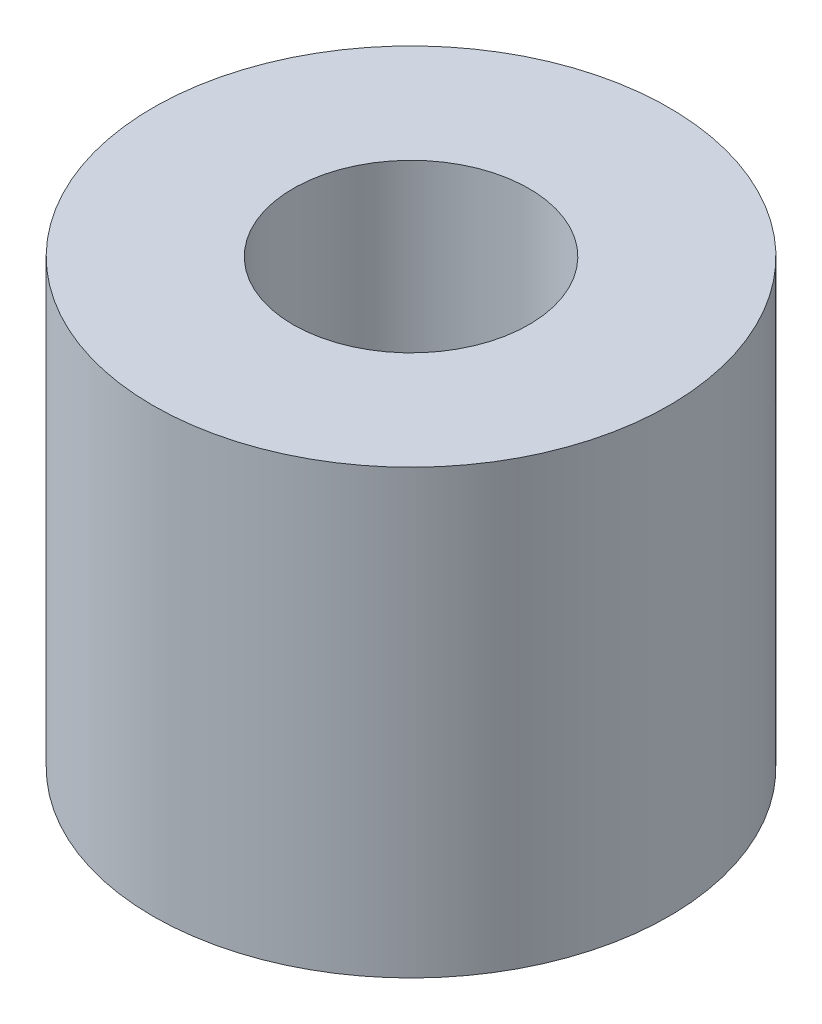
ISO-10303-21;
HEADER;
FILE_DESCRIPTION(('STEP AP214'),'2;1');
FILE_NAME('part.step','',(''),(''),'','','');
FILE_SCHEMA(('AUTOMOTIVE_DESIGN { 1 0 10303 214 1 1 1 1 }'));
ENDSEC;
DATA;
#1=APPLICATION_CONTEXT('core data for automotive mechanical design processes');
#2=APPLICATION_PROTOCOL_DEFINITION('international standard','automotive_design',2000,#1);
#3=PRODUCT_CONTEXT('',#1,'mechanical');
#4=PRODUCT('Part','Part','',(#3));
#5=PRODUCT_RELATED_PRODUCT_CATEGORY('part','',(#4));
#6=PRODUCT_DEFINITION_FORMATION('','',#4);
#7=PRODUCT_DEFINITION_CONTEXT('part definition',#1,'design');
#8=PRODUCT_DEFINITION('design','',#6,#7);
#9=PRODUCT_DEFINITION_SHAPE('','',#8);
#10=(LENGTH_UNIT() NAMED_UNIT(*) SI_UNIT(.MILLI.,.METRE.));
#11=(NAMED_UNIT(*) PLANE_ANGLE_UNIT() SI_UNIT($,.RADIAN.));
#12=(NAMED_UNIT(*) SI_UNIT($,.STERADIAN.) SOLID_ANGLE_UNIT());
#13=UNCERTAINTY_MEASURE_WITH_UNIT(LENGTH_MEASURE(1.E-05),#10,'distance_accuracy_value','');
#14=(GEOMETRIC_REPRESENTATION_CONTEXT(3) GLOBAL_UNCERTAINTY_ASSIGNED_CONTEXT((#13)) GLOBAL_UNIT_ASSIGNED_CONTEXT((#10,
#11,#12)) REPRESENTATION_CONTEXT('',''));
#15=CARTESIAN_POINT('',(0.,0.,0.));
#16=DIRECTION('',(0.,0.,1.));
#17=DIRECTION('',(1.,0.,0.));
#18=AXIS2_PLACEMENT_3D('',#15,#16,#17);
#19=CARTESIAN_POINT('',(0.,3.,0.));
#20=DIRECTION('',(0.,-1.,0.));
#21=DIRECTION('',(0.,0.,-1.));
#22=AXIS2_PLACEMENT_3D('',#19,#20,#21);
#23=CYLINDRICAL_SURFACE('',#22,1.75);
#24=CARTESIAN_POINT('',(0.,3.,0.));
#25=DIRECTION('',(0.,1.,0.));
#26=DIRECTION('',(0.,0.,1.));
#27=AXIS2_PLACEMENT_3D('',#24,#25,#26);
#28=CIRCLE('',#27,1.75);
#29=CARTESIAN_POINT('',(0.,3.,1.75));
#30=VERTEX_POINT('',#29);
#31=EDGE_CURVE('E10',#30,#30,#28,.T.);
#32=ORIENTED_EDGE('',*,*,#31,.F.);
#33=EDGE_LOOP('',(#32));
#34=FACE_BOUND('',#33,.T.);
#35=CARTESIAN_POINT('',(0.,0.,0.));
#36=DIRECTION('',(0.,1.,0.));
#37=DIRECTION('',(0.,0.,1.));
#38=AXIS2_PLACEMENT_3D('',#35,#36,#37);
#39=CIRCLE('',#38,1.75);
#40=CARTESIAN_POINT('',(0.,0.,1.75));
#41=VERTEX_POINT('',#40);
#42=EDGE_CURVE('E39',#41,#41,#39,.T.);
#43=ORIENTED_EDGE('',*,*,#42,.T.);
#44=EDGE_LOOP('',(#43));
#45=FACE_BOUND('',#44,.T.);
#46=ADVANCED_FACE('F36',(#34,#45),#23,.T.);
#47=CARTESIAN_POINT('',(0.,3.,0.));
#48=DIRECTION('',(0.,1.,0.));
#49=DIRECTION('',(0.,0.,1.));
#50=AXIS2_PLACEMENT_3D('',#47,#48,#49);
#51=PLANE('',#50);
#52=CARTESIAN_POINT('',(0.,3.,0.));
#53=DIRECTION('',(0.,1.,0.));
#54=DIRECTION('',(0.,0.,1.));
#55=AXIS2_PLACEMENT_3D('',#52,#53,#54);
#56=CIRCLE('',#55,0.799999999999988);
#57=CARTESIAN_POINT('',(0.,3.,0.799999999999988));
#58=VERTEX_POINT('',#57);
#59=EDGE_CURVE('E50',#58,#58,#56,.T.);
#60=ORIENTED_EDGE('',*,*,#59,.F.);
#61=EDGE_LOOP('',(#60));
#62=FACE_BOUND('',#61,.T.);
#63=ORIENTED_EDGE('',*,*,#31,.T.);
#64=EDGE_LOOP('',(#63));
#65=FACE_BOUND('',#64,.T.);
#66=ADVANCED_FACE('F56',(#62,#65),#51,.T.);
#67=CARTESIAN_POINT('',(0.,0.,0.));
#68=DIRECTION('',(0.,1.,0.));
#69=DIRECTION('',(0.,0.,1.));
#70=AXIS2_PLACEMENT_3D('',#67,#68,#69);
#71=PLANE('',#70);
#72=CARTESIAN_POINT('',(0.,0.,0.));
#73=DIRECTION('',(0.,1.,0.));
#74=DIRECTION('',(0.,0.,1.));
#75=AXIS2_PLACEMENT_3D('',#72,#73,#74);
#76=CIRCLE('',#75,0.799999999999999);
#77=CARTESIAN_POINT('',(0.,0.,0.799999999999999));
#78=VERTEX_POINT('',#77);
#79=EDGE_CURVE('E46',#78,#78,#76,.T.);
#80=ORIENTED_EDGE('',*,*,#79,.T.);
#81=EDGE_LOOP('',(#80));
#82=FACE_BOUND('',#81,.T.);
#83=ORIENTED_EDGE('',*,*,#42,.F.);
#84=EDGE_LOOP('',(#83));
#85=FACE_BOUND('',#84,.T.);
#86=ADVANCED_FACE('F58',(#82,#85),#71,.F.);
#87=CARTESIAN_POINT('',(0.,3.,0.));
#88=DIRECTION('',(0.,1.,0.));
#89=DIRECTION('',(0.,0.,1.));
#90=AXIS2_PLACEMENT_3D('',#87,#88,#89);
#91=CYLINDRICAL_SURFACE('',#90,0.799999999999993);
#92=ORIENTED_EDGE('',*,*,#79,.F.);
#93=EDGE_LOOP('',(#92));
#94=FACE_BOUND('',#93,.T.);
#95=ORIENTED_EDGE('',*,*,#59,.T.);
#96=EDGE_LOOP('',(#95));
#97=FACE_BOUND('',#96,.T.);
#98=ADVANCED_FACE('F54',(#94,#97),#91,.F.);
#99=CLOSED_SHELL('',(#46,#66,#86,#98));
#100=MANIFOLD_SOLID_BREP('B2',#99);
#101=ADVANCED_BREP_SHAPE_REPRESENTATION('',(#18,#100),#14);
#102=SHAPE_DEFINITION_REPRESENTATION(#9,#101);
ENDSEC;
END-ISO-10303-21;
